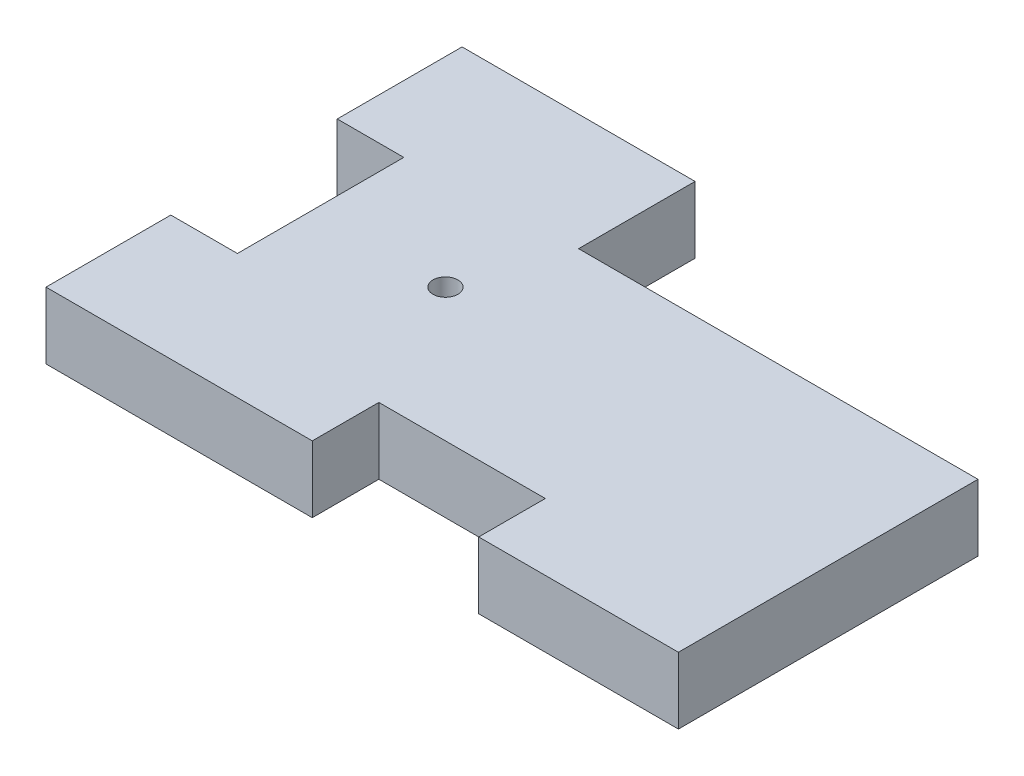
ISO-10303-21;
HEADER;
FILE_DESCRIPTION(('STEP AP214'),'2;1');
FILE_NAME('part.step','',(''),(''),'','','');
FILE_SCHEMA(('AUTOMOTIVE_DESIGN { 1 0 10303 214 1 1 1 1 }'));
ENDSEC;
DATA;
#1=APPLICATION_CONTEXT('core data for automotive mechanical design processes');
#2=APPLICATION_PROTOCOL_DEFINITION('international standard','automotive_design',2000,#1);
#3=PRODUCT_CONTEXT('',#1,'mechanical');
#4=PRODUCT('Part','Part','',(#3));
#5=PRODUCT_RELATED_PRODUCT_CATEGORY('part','',(#4));
#6=PRODUCT_DEFINITION_FORMATION('','',#4);
#7=PRODUCT_DEFINITION_CONTEXT('part definition',#1,'design');
#8=PRODUCT_DEFINITION('design','',#6,#7);
#9=PRODUCT_DEFINITION_SHAPE('','',#8);
#10=(LENGTH_UNIT() NAMED_UNIT(*) SI_UNIT(.MILLI.,.METRE.));
#11=(NAMED_UNIT(*) PLANE_ANGLE_UNIT() SI_UNIT($,.RADIAN.));
#12=(NAMED_UNIT(*) SI_UNIT($,.STERADIAN.) SOLID_ANGLE_UNIT());
#13=UNCERTAINTY_MEASURE_WITH_UNIT(LENGTH_MEASURE(1.E-05),#10,'distance_accuracy_value','');
#14=(GEOMETRIC_REPRESENTATION_CONTEXT(3) GLOBAL_UNCERTAINTY_ASSIGNED_CONTEXT((#13)) GLOBAL_UNIT_ASSIGNED_CONTEXT((#10,
#11,#12)) REPRESENTATION_CONTEXT('',''));
#15=CARTESIAN_POINT('',(0.,0.,0.));
#16=DIRECTION('',(0.,0.,1.));
#17=DIRECTION('',(1.,0.,0.));
#18=AXIS2_PLACEMENT_3D('',#15,#16,#17);
#19=CARTESIAN_POINT('',(0.,4.,25.));
#20=DIRECTION('',(0.,0.,-1.));
#21=DIRECTION('',(-1.,0.,0.));
#22=AXIS2_PLACEMENT_3D('',#19,#20,#21);
#23=PLANE('',#22);
#24=DIRECTION('',(1.,0.,0.));
#25=VECTOR('',#24,1.);
#26=CARTESIAN_POINT('',(0.,0.,25.));
#27=LINE('',#26,#25);
#28=CARTESIAN_POINT('',(0.,0.,25.));
#29=VERTEX_POINT('',#28);
#30=CARTESIAN_POINT('',(15.9999999999999,0.,25.));
#31=VERTEX_POINT('',#30);
#32=EDGE_CURVE('E231',#29,#31,#27,.T.);
#33=ORIENTED_EDGE('',*,*,#32,.T.);
#34=DIRECTION('',(0.,-1.,0.));
#35=VECTOR('',#34,1.);
#36=CARTESIAN_POINT('',(15.9999999999999,4.,25.));
#37=LINE('',#36,#35);
#38=CARTESIAN_POINT('',(15.9999999999999,4.,25.));
#39=VERTEX_POINT('',#38);
#40=EDGE_CURVE('E166',#39,#31,#37,.T.);
#41=ORIENTED_EDGE('',*,*,#40,.F.);
#42=DIRECTION('',(1.,0.,0.));
#43=VECTOR('',#42,1.);
#44=CARTESIAN_POINT('',(0.,4.,25.));
#45=LINE('',#44,#43);
#46=CARTESIAN_POINT('',(0.,4.,25.));
#47=VERTEX_POINT('',#46);
#48=EDGE_CURVE('E153',#47,#39,#45,.T.);
#49=ORIENTED_EDGE('',*,*,#48,.F.);
#50=DIRECTION('',(0.,-1.,0.));
#51=VECTOR('',#50,1.);
#52=CARTESIAN_POINT('',(0.,4.,25.));
#53=LINE('',#52,#51);
#54=EDGE_CURVE('E11',#47,#29,#53,.T.);
#55=ORIENTED_EDGE('',*,*,#54,.T.);
#56=EDGE_LOOP('',(#33,#41,#49,#55));
#57=FACE_BOUND('',#56,.T.);
#58=ADVANCED_FACE('F33',(#57),#23,.F.);
#59=CARTESIAN_POINT('',(0.,4.,0.));
#60=DIRECTION('',(1.,0.,0.));
#61=DIRECTION('',(0.,0.,-1.));
#62=AXIS2_PLACEMENT_3D('',#59,#60,#61);
#63=PLANE('',#62);
#64=DIRECTION('',(0.,0.,1.));
#65=VECTOR('',#64,1.);
#66=CARTESIAN_POINT('',(0.,0.,0.));
#67=LINE('',#66,#65);
#68=CARTESIAN_POINT('',(0.,0.,0.));
#69=VERTEX_POINT('',#68);
#70=CARTESIAN_POINT('',(0.,0.,7.5));
#71=VERTEX_POINT('',#70);
#72=EDGE_CURVE('E227',#69,#71,#67,.T.);
#73=ORIENTED_EDGE('',*,*,#72,.T.);
#74=DIRECTION('',(0.,-1.,0.));
#75=VECTOR('',#74,1.);
#76=CARTESIAN_POINT('',(0.,4.,7.5));
#77=LINE('',#76,#75);
#78=CARTESIAN_POINT('',(0.,4.,7.5));
#79=VERTEX_POINT('',#78);
#80=EDGE_CURVE('E191',#79,#71,#77,.T.);
#81=ORIENTED_EDGE('',*,*,#80,.F.);
#82=DIRECTION('',(0.,0.,1.));
#83=VECTOR('',#82,1.);
#84=CARTESIAN_POINT('',(0.,4.,0.));
#85=LINE('',#84,#83);
#86=CARTESIAN_POINT('',(0.,4.,0.));
#87=VERTEX_POINT('',#86);
#88=EDGE_CURVE('E215',#87,#79,#85,.T.);
#89=ORIENTED_EDGE('',*,*,#88,.F.);
#90=DIRECTION('',(0.,-1.,0.));
#91=VECTOR('',#90,1.);
#92=CARTESIAN_POINT('',(0.,4.,0.));
#93=LINE('',#92,#91);
#94=EDGE_CURVE('E226',#87,#69,#93,.T.);
#95=ORIENTED_EDGE('',*,*,#94,.T.);
#96=EDGE_LOOP('',(#73,#81,#89,#95));
#97=FACE_BOUND('',#96,.T.);
#98=ADVANCED_FACE('F283',(#97),#63,.F.);
#99=CARTESIAN_POINT('',(0.,4.,17.5));
#100=VERTEX_POINT('',#99);
#101=EDGE_CURVE('E219',#100,#47,#85,.T.);
#102=ORIENTED_EDGE('',*,*,#101,.F.);
#103=DIRECTION('',(0.,-1.,0.));
#104=VECTOR('',#103,1.);
#105=CARTESIAN_POINT('',(0.,4.,17.5));
#106=LINE('',#105,#104);
#107=CARTESIAN_POINT('',(0.,0.,17.5));
#108=VERTEX_POINT('',#107);
#109=EDGE_CURVE('E193',#100,#108,#106,.T.);
#110=ORIENTED_EDGE('',*,*,#109,.T.);
#111=EDGE_CURVE('E211',#108,#29,#67,.T.);
#112=ORIENTED_EDGE('',*,*,#111,.T.);
#113=ORIENTED_EDGE('',*,*,#54,.F.);
#114=EDGE_LOOP('',(#102,#110,#112,#113));
#115=FACE_BOUND('',#114,.T.);
#116=ADVANCED_FACE('F35',(#115),#63,.F.);
#117=CARTESIAN_POINT('',(25.9999999999999,4.,25.));
#118=VERTEX_POINT('',#117);
#119=CARTESIAN_POINT('',(38.,4.,25.));
#120=VERTEX_POINT('',#119);
#121=EDGE_CURVE('E218',#118,#120,#45,.T.);
#122=ORIENTED_EDGE('',*,*,#121,.F.);
#123=DIRECTION('',(0.,-1.,0.));
#124=VECTOR('',#123,1.);
#125=CARTESIAN_POINT('',(25.9999999999999,4.,25.));
#126=LINE('',#125,#124);
#127=CARTESIAN_POINT('',(25.9999999999999,0.,25.));
#128=VERTEX_POINT('',#127);
#129=EDGE_CURVE('E168',#118,#128,#126,.T.);
#130=ORIENTED_EDGE('',*,*,#129,.T.);
#131=CARTESIAN_POINT('',(38.,0.,25.));
#132=VERTEX_POINT('',#131);
#133=EDGE_CURVE('E230',#128,#132,#27,.T.);
#134=ORIENTED_EDGE('',*,*,#133,.T.);
#135=DIRECTION('',(0.,-1.,0.));
#136=VECTOR('',#135,1.);
#137=CARTESIAN_POINT('',(38.,4.,25.));
#138=LINE('',#137,#136);
#139=EDGE_CURVE('E41',#120,#132,#138,.T.);
#140=ORIENTED_EDGE('',*,*,#139,.F.);
#141=EDGE_LOOP('',(#122,#130,#134,#140));
#142=FACE_BOUND('',#141,.T.);
#143=ADVANCED_FACE('F262',(#142),#23,.F.);
#144=CARTESIAN_POINT('',(38.,4.,0.));
#145=DIRECTION('',(-1.,0.,0.));
#146=DIRECTION('',(0.,0.,1.));
#147=AXIS2_PLACEMENT_3D('',#144,#145,#146);
#148=PLANE('',#147);
#149=DIRECTION('',(0.,0.,-1.));
#150=VECTOR('',#149,1.);
#151=CARTESIAN_POINT('',(38.,0.,0.));
#152=LINE('',#151,#150);
#153=CARTESIAN_POINT('',(38.,0.,7.));
#154=VERTEX_POINT('',#153);
#155=EDGE_CURVE('E234',#132,#154,#152,.T.);
#156=ORIENTED_EDGE('',*,*,#155,.T.);
#157=DIRECTION('',(0.,1.,0.));
#158=VECTOR('',#157,1.);
#159=CARTESIAN_POINT('',(38.,0.,7.));
#160=LINE('',#159,#158);
#161=CARTESIAN_POINT('',(38.,4.,7.));
#162=VERTEX_POINT('',#161);
#163=EDGE_CURVE('E208',#154,#162,#160,.T.);
#164=ORIENTED_EDGE('',*,*,#163,.T.);
#165=DIRECTION('',(0.,0.,-1.));
#166=VECTOR('',#165,1.);
#167=CARTESIAN_POINT('',(38.,4.,0.));
#168=LINE('',#167,#166);
#169=EDGE_CURVE('E221',#120,#162,#168,.T.);
#170=ORIENTED_EDGE('',*,*,#169,.F.);
#171=ORIENTED_EDGE('',*,*,#139,.T.);
#172=EDGE_LOOP('',(#156,#164,#170,#171));
#173=FACE_BOUND('',#172,.T.);
#174=ADVANCED_FACE('F245',(#173),#148,.F.);
#175=CARTESIAN_POINT('',(0.,4.,0.));
#176=DIRECTION('',(0.,0.,1.));
#177=DIRECTION('',(1.,0.,0.));
#178=AXIS2_PLACEMENT_3D('',#175,#176,#177);
#179=PLANE('',#178);
#180=DIRECTION('',(-1.,0.,0.));
#181=VECTOR('',#180,1.);
#182=CARTESIAN_POINT('',(0.,4.,0.));
#183=LINE('',#182,#181);
#184=CARTESIAN_POINT('',(14.,4.,0.));
#185=VERTEX_POINT('',#184);
#186=EDGE_CURVE('E224',#185,#87,#183,.T.);
#187=ORIENTED_EDGE('',*,*,#186,.F.);
#188=DIRECTION('',(0.,1.,0.));
#189=VECTOR('',#188,1.);
#190=CARTESIAN_POINT('',(14.,0.,0.));
#191=LINE('',#190,#189);
#192=CARTESIAN_POINT('',(14.,0.,0.));
#193=VERTEX_POINT('',#192);
#194=EDGE_CURVE('E204',#193,#185,#191,.T.);
#195=ORIENTED_EDGE('',*,*,#194,.F.);
#196=DIRECTION('',(-1.,0.,0.));
#197=VECTOR('',#196,1.);
#198=CARTESIAN_POINT('',(0.,0.,0.));
#199=LINE('',#198,#197);
#200=EDGE_CURVE('E237',#193,#69,#199,.T.);
#201=ORIENTED_EDGE('',*,*,#200,.T.);
#202=ORIENTED_EDGE('',*,*,#94,.F.);
#203=EDGE_LOOP('',(#187,#195,#201,#202));
#204=FACE_BOUND('',#203,.T.);
#205=ADVANCED_FACE('F287',(#204),#179,.F.);
#206=CARTESIAN_POINT('',(0.,4.,0.));
#207=DIRECTION('',(0.,1.,0.));
#208=DIRECTION('',(0.,0.,1.));
#209=AXIS2_PLACEMENT_3D('',#206,#207,#208);
#210=PLANE('',#209);
#211=CARTESIAN_POINT('',(12.,4.,13.));
#212=DIRECTION('',(0.,1.,0.));
#213=DIRECTION('',(0.,0.,1.));
#214=AXIS2_PLACEMENT_3D('',#211,#212,#213);
#215=CIRCLE('',#214,0.75);
#216=CARTESIAN_POINT('',(12.,4.,13.75));
#217=VERTEX_POINT('',#216);
#218=EDGE_CURVE('E159',#217,#217,#215,.T.);
#219=ORIENTED_EDGE('',*,*,#218,.F.);
#220=EDGE_LOOP('',(#219));
#221=FACE_BOUND('',#220,.T.);
#222=DIRECTION('',(0.,0.,-1.));
#223=VECTOR('',#222,1.);
#224=CARTESIAN_POINT('',(15.9999999999999,4.,21.));
#225=LINE('',#224,#223);
#226=CARTESIAN_POINT('',(15.9999999999999,4.,21.));
#227=VERTEX_POINT('',#226);
#228=EDGE_CURVE('E135',#39,#227,#225,.T.);
#229=ORIENTED_EDGE('',*,*,#228,.T.);
#230=DIRECTION('',(1.,0.,0.));
#231=VECTOR('',#230,1.);
#232=CARTESIAN_POINT('',(15.9999999999999,4.,21.));
#233=LINE('',#232,#231);
#234=CARTESIAN_POINT('',(25.9999999999999,4.,21.));
#235=VERTEX_POINT('',#234);
#236=EDGE_CURVE('E144',#227,#235,#233,.T.);
#237=ORIENTED_EDGE('',*,*,#236,.T.);
#238=DIRECTION('',(0.,0.,1.));
#239=VECTOR('',#238,1.);
#240=CARTESIAN_POINT('',(25.9999999999999,4.,21.));
#241=LINE('',#240,#239);
#242=EDGE_CURVE('E141',#235,#118,#241,.T.);
#243=ORIENTED_EDGE('',*,*,#242,.T.);
#244=ORIENTED_EDGE('',*,*,#121,.T.);
#245=ORIENTED_EDGE('',*,*,#169,.T.);
#246=DIRECTION('',(1.,0.,0.));
#247=VECTOR('',#246,1.);
#248=CARTESIAN_POINT('',(38.,4.,7.));
#249=LINE('',#248,#247);
#250=CARTESIAN_POINT('',(14.,4.,7.));
#251=VERTEX_POINT('',#250);
#252=EDGE_CURVE('E201',#251,#162,#249,.T.);
#253=ORIENTED_EDGE('',*,*,#252,.F.);
#254=DIRECTION('',(0.,0.,1.));
#255=VECTOR('',#254,1.);
#256=CARTESIAN_POINT('',(14.,4.,0.));
#257=LINE('',#256,#255);
#258=EDGE_CURVE('E190',#185,#251,#257,.T.);
#259=ORIENTED_EDGE('',*,*,#258,.F.);
#260=ORIENTED_EDGE('',*,*,#186,.T.);
#261=ORIENTED_EDGE('',*,*,#88,.T.);
#262=DIRECTION('',(1.,0.,0.));
#263=VECTOR('',#262,1.);
#264=CARTESIAN_POINT('',(4.,4.,7.5));
#265=LINE('',#264,#263);
#266=CARTESIAN_POINT('',(4.,4.,7.5));
#267=VERTEX_POINT('',#266);
#268=EDGE_CURVE('E179',#79,#267,#265,.T.);
#269=ORIENTED_EDGE('',*,*,#268,.T.);
#270=DIRECTION('',(0.,0.,1.));
#271=VECTOR('',#270,1.);
#272=CARTESIAN_POINT('',(4.,4.,7.5));
#273=LINE('',#272,#271);
#274=CARTESIAN_POINT('',(4.,4.,17.5));
#275=VERTEX_POINT('',#274);
#276=EDGE_CURVE('E172',#267,#275,#273,.T.);
#277=ORIENTED_EDGE('',*,*,#276,.T.);
#278=DIRECTION('',(-1.,0.,0.));
#279=VECTOR('',#278,1.);
#280=CARTESIAN_POINT('',(4.,4.,17.5));
#281=LINE('',#280,#279);
#282=EDGE_CURVE('E175',#275,#100,#281,.T.);
#283=ORIENTED_EDGE('',*,*,#282,.T.);
#284=ORIENTED_EDGE('',*,*,#101,.T.);
#285=ORIENTED_EDGE('',*,*,#48,.T.);
#286=EDGE_LOOP('',(#229,#237,#243,#244,#245,#253,#259,#260,#261,#269,#277,#283,#284,#285));
#287=FACE_BOUND('',#286,.T.);
#288=ADVANCED_FACE('F151',(#221,#287),#210,.T.);
#289=CARTESIAN_POINT('',(0.,0.,0.));
#290=DIRECTION('',(0.,1.,0.));
#291=DIRECTION('',(0.,0.,1.));
#292=AXIS2_PLACEMENT_3D('',#289,#290,#291);
#293=PLANE('',#292);
#294=CARTESIAN_POINT('',(12.,0.,13.));
#295=DIRECTION('',(0.,1.,0.));
#296=DIRECTION('',(0.,0.,1.));
#297=AXIS2_PLACEMENT_3D('',#294,#295,#296);
#298=CIRCLE('',#297,0.75);
#299=CARTESIAN_POINT('',(12.,0.,13.75));
#300=VERTEX_POINT('',#299);
#301=EDGE_CURVE('E164',#300,#300,#298,.T.);
#302=ORIENTED_EDGE('',*,*,#301,.T.);
#303=EDGE_LOOP('',(#302));
#304=FACE_BOUND('',#303,.T.);
#305=DIRECTION('',(1.,0.,0.));
#306=VECTOR('',#305,1.);
#307=CARTESIAN_POINT('',(15.9999999999999,0.,21.));
#308=LINE('',#307,#306);
#309=CARTESIAN_POINT('',(15.9999999999999,0.,21.));
#310=VERTEX_POINT('',#309);
#311=CARTESIAN_POINT('',(25.9999999999999,0.,21.));
#312=VERTEX_POINT('',#311);
#313=EDGE_CURVE('E156',#310,#312,#308,.T.);
#314=ORIENTED_EDGE('',*,*,#313,.F.);
#315=DIRECTION('',(0.,0.,-1.));
#316=VECTOR('',#315,1.);
#317=CARTESIAN_POINT('',(15.9999999999999,0.,21.));
#318=LINE('',#317,#316);
#319=EDGE_CURVE('E48',#31,#310,#318,.T.);
#320=ORIENTED_EDGE('',*,*,#319,.F.);
#321=ORIENTED_EDGE('',*,*,#32,.F.);
#322=ORIENTED_EDGE('',*,*,#111,.F.);
#323=DIRECTION('',(-1.,0.,0.));
#324=VECTOR('',#323,1.);
#325=CARTESIAN_POINT('',(4.,0.,17.5));
#326=LINE('',#325,#324);
#327=CARTESIAN_POINT('',(4.,0.,17.5));
#328=VERTEX_POINT('',#327);
#329=EDGE_CURVE('E184',#328,#108,#326,.T.);
#330=ORIENTED_EDGE('',*,*,#329,.F.);
#331=DIRECTION('',(0.,0.,1.));
#332=VECTOR('',#331,1.);
#333=CARTESIAN_POINT('',(4.,0.,7.5));
#334=LINE('',#333,#332);
#335=CARTESIAN_POINT('',(4.,0.,7.5));
#336=VERTEX_POINT('',#335);
#337=EDGE_CURVE('E56',#336,#328,#334,.T.);
#338=ORIENTED_EDGE('',*,*,#337,.F.);
#339=DIRECTION('',(1.,0.,0.));
#340=VECTOR('',#339,1.);
#341=CARTESIAN_POINT('',(4.,0.,7.5));
#342=LINE('',#341,#340);
#343=EDGE_CURVE('E176',#71,#336,#342,.T.);
#344=ORIENTED_EDGE('',*,*,#343,.F.);
#345=ORIENTED_EDGE('',*,*,#72,.F.);
#346=ORIENTED_EDGE('',*,*,#200,.F.);
#347=DIRECTION('',(0.,0.,1.));
#348=VECTOR('',#347,1.);
#349=CARTESIAN_POINT('',(14.,0.,0.));
#350=LINE('',#349,#348);
#351=CARTESIAN_POINT('',(14.,0.,7.));
#352=VERTEX_POINT('',#351);
#353=EDGE_CURVE('E197',#193,#352,#350,.T.);
#354=ORIENTED_EDGE('',*,*,#353,.T.);
#355=DIRECTION('',(1.,0.,0.));
#356=VECTOR('',#355,1.);
#357=CARTESIAN_POINT('',(38.,0.,7.));
#358=LINE('',#357,#356);
#359=EDGE_CURVE('E200',#352,#154,#358,.T.);
#360=ORIENTED_EDGE('',*,*,#359,.T.);
#361=ORIENTED_EDGE('',*,*,#155,.F.);
#362=ORIENTED_EDGE('',*,*,#133,.F.);
#363=DIRECTION('',(0.,0.,1.));
#364=VECTOR('',#363,1.);
#365=CARTESIAN_POINT('',(25.9999999999999,0.,21.));
#366=LINE('',#365,#364);
#367=EDGE_CURVE('E154',#312,#128,#366,.T.);
#368=ORIENTED_EDGE('',*,*,#367,.F.);
#369=EDGE_LOOP('',(#314,#320,#321,#322,#330,#338,#344,#345,#346,#354,#360,#361,#362,#368));
#370=FACE_BOUND('',#369,.T.);
#371=ADVANCED_FACE('F250',(#304,#370),#293,.F.);
#372=CARTESIAN_POINT('',(38.,0.,7.));
#373=DIRECTION('',(0.,0.,1.));
#374=DIRECTION('',(1.,0.,0.));
#375=AXIS2_PLACEMENT_3D('',#372,#373,#374);
#376=PLANE('',#375);
#377=ORIENTED_EDGE('',*,*,#252,.T.);
#378=ORIENTED_EDGE('',*,*,#163,.F.);
#379=ORIENTED_EDGE('',*,*,#359,.F.);
#380=DIRECTION('',(0.,1.,0.));
#381=VECTOR('',#380,1.);
#382=CARTESIAN_POINT('',(14.,0.,7.));
#383=LINE('',#382,#381);
#384=EDGE_CURVE('E212',#352,#251,#383,.T.);
#385=ORIENTED_EDGE('',*,*,#384,.T.);
#386=EDGE_LOOP('',(#377,#378,#379,#385));
#387=FACE_BOUND('',#386,.T.);
#388=ADVANCED_FACE('F255',(#387),#376,.F.);
#389=CARTESIAN_POINT('',(14.,0.,0.));
#390=DIRECTION('',(-1.,0.,0.));
#391=DIRECTION('',(0.,0.,1.));
#392=AXIS2_PLACEMENT_3D('',#389,#390,#391);
#393=PLANE('',#392);
#394=ORIENTED_EDGE('',*,*,#258,.T.);
#395=ORIENTED_EDGE('',*,*,#384,.F.);
#396=ORIENTED_EDGE('',*,*,#353,.F.);
#397=ORIENTED_EDGE('',*,*,#194,.T.);
#398=EDGE_LOOP('',(#394,#395,#396,#397));
#399=FACE_BOUND('',#398,.T.);
#400=ADVANCED_FACE('F257',(#399),#393,.F.);
#401=CARTESIAN_POINT('',(4.,4.,7.5));
#402=DIRECTION('',(1.,0.,0.));
#403=DIRECTION('',(0.,0.,-1.));
#404=AXIS2_PLACEMENT_3D('',#401,#402,#403);
#405=PLANE('',#404);
#406=ORIENTED_EDGE('',*,*,#337,.T.);
#407=DIRECTION('',(0.,-1.,0.));
#408=VECTOR('',#407,1.);
#409=CARTESIAN_POINT('',(4.,4.,17.5));
#410=LINE('',#409,#408);
#411=EDGE_CURVE('E182',#275,#328,#410,.T.);
#412=ORIENTED_EDGE('',*,*,#411,.F.);
#413=ORIENTED_EDGE('',*,*,#276,.F.);
#414=DIRECTION('',(0.,-1.,0.));
#415=VECTOR('',#414,1.);
#416=CARTESIAN_POINT('',(4.,4.,7.5));
#417=LINE('',#416,#415);
#418=EDGE_CURVE('E188',#267,#336,#417,.T.);
#419=ORIENTED_EDGE('',*,*,#418,.T.);
#420=EDGE_LOOP('',(#406,#412,#413,#419));
#421=FACE_BOUND('',#420,.T.);
#422=ADVANCED_FACE('F277',(#421),#405,.F.);
#423=CARTESIAN_POINT('',(4.,4.,7.5));
#424=DIRECTION('',(0.,0.,-1.));
#425=DIRECTION('',(-1.,0.,0.));
#426=AXIS2_PLACEMENT_3D('',#423,#424,#425);
#427=PLANE('',#426);
#428=ORIENTED_EDGE('',*,*,#343,.T.);
#429=ORIENTED_EDGE('',*,*,#418,.F.);
#430=ORIENTED_EDGE('',*,*,#268,.F.);
#431=ORIENTED_EDGE('',*,*,#80,.T.);
#432=EDGE_LOOP('',(#428,#429,#430,#431));
#433=FACE_BOUND('',#432,.T.);
#434=ADVANCED_FACE('F281',(#433),#427,.F.);
#435=CARTESIAN_POINT('',(4.,4.,17.5));
#436=DIRECTION('',(0.,0.,1.));
#437=DIRECTION('',(1.,0.,0.));
#438=AXIS2_PLACEMENT_3D('',#435,#436,#437);
#439=PLANE('',#438);
#440=ORIENTED_EDGE('',*,*,#329,.T.);
#441=ORIENTED_EDGE('',*,*,#109,.F.);
#442=ORIENTED_EDGE('',*,*,#282,.F.);
#443=ORIENTED_EDGE('',*,*,#411,.T.);
#444=EDGE_LOOP('',(#440,#441,#442,#443));
#445=FACE_BOUND('',#444,.T.);
#446=ADVANCED_FACE('F274',(#445),#439,.F.);
#447=CARTESIAN_POINT('',(15.9999999999999,4.,21.));
#448=DIRECTION('',(-1.,0.,0.));
#449=DIRECTION('',(0.,0.,1.));
#450=AXIS2_PLACEMENT_3D('',#447,#448,#449);
#451=PLANE('',#450);
#452=ORIENTED_EDGE('',*,*,#319,.T.);
#453=DIRECTION('',(0.,-1.,0.));
#454=VECTOR('',#453,1.);
#455=CARTESIAN_POINT('',(15.9999999999999,4.,21.));
#456=LINE('',#455,#454);
#457=EDGE_CURVE('E131',#227,#310,#456,.T.);
#458=ORIENTED_EDGE('',*,*,#457,.F.);
#459=ORIENTED_EDGE('',*,*,#228,.F.);
#460=ORIENTED_EDGE('',*,*,#40,.T.);
#461=EDGE_LOOP('',(#452,#458,#459,#460));
#462=FACE_BOUND('',#461,.T.);
#463=ADVANCED_FACE('F133',(#462),#451,.F.);
#464=CARTESIAN_POINT('',(25.9999999999999,4.,21.));
#465=DIRECTION('',(1.,0.,0.));
#466=DIRECTION('',(0.,0.,-1.));
#467=AXIS2_PLACEMENT_3D('',#464,#465,#466);
#468=PLANE('',#467);
#469=ORIENTED_EDGE('',*,*,#367,.T.);
#470=ORIENTED_EDGE('',*,*,#129,.F.);
#471=ORIENTED_EDGE('',*,*,#242,.F.);
#472=DIRECTION('',(0.,-1.,0.));
#473=VECTOR('',#472,1.);
#474=CARTESIAN_POINT('',(25.9999999999999,4.,21.));
#475=LINE('',#474,#473);
#476=EDGE_CURVE('E140',#235,#312,#475,.T.);
#477=ORIENTED_EDGE('',*,*,#476,.T.);
#478=EDGE_LOOP('',(#469,#470,#471,#477));
#479=FACE_BOUND('',#478,.T.);
#480=ADVANCED_FACE('F264',(#479),#468,.F.);
#481=CARTESIAN_POINT('',(15.9999999999999,4.,21.));
#482=DIRECTION('',(0.,0.,-1.));
#483=DIRECTION('',(-1.,0.,0.));
#484=AXIS2_PLACEMENT_3D('',#481,#482,#483);
#485=PLANE('',#484);
#486=ORIENTED_EDGE('',*,*,#313,.T.);
#487=ORIENTED_EDGE('',*,*,#476,.F.);
#488=ORIENTED_EDGE('',*,*,#236,.F.);
#489=ORIENTED_EDGE('',*,*,#457,.T.);
#490=EDGE_LOOP('',(#486,#487,#488,#489));
#491=FACE_BOUND('',#490,.T.);
#492=ADVANCED_FACE('F145',(#491),#485,.F.);
#493=CARTESIAN_POINT('',(12.,0.,13.));
#494=DIRECTION('',(0.,1.,0.));
#495=DIRECTION('',(0.,0.,1.));
#496=AXIS2_PLACEMENT_3D('',#493,#494,#495);
#497=CYLINDRICAL_SURFACE('',#496,0.75);
#498=ORIENTED_EDGE('',*,*,#301,.F.);
#499=EDGE_LOOP('',(#498));
#500=FACE_BOUND('',#499,.T.);
#501=ORIENTED_EDGE('',*,*,#218,.T.);
#502=EDGE_LOOP('',(#501));
#503=FACE_BOUND('',#502,.T.);
#504=ADVANCED_FACE('F379',(#500,#503),#497,.F.);
#505=CLOSED_SHELL('',(#58,#98,#116,#143,#174,#205,#288,#371,#388,#400,#422,#434,#446,#463,#480,
#492,#504));
#506=MANIFOLD_SOLID_BREP('B2',#505);
#507=ADVANCED_BREP_SHAPE_REPRESENTATION('',(#18,#506),#14);
#508=SHAPE_DEFINITION_REPRESENTATION(#9,#507);
ENDSEC;
END-ISO-10303-21;
